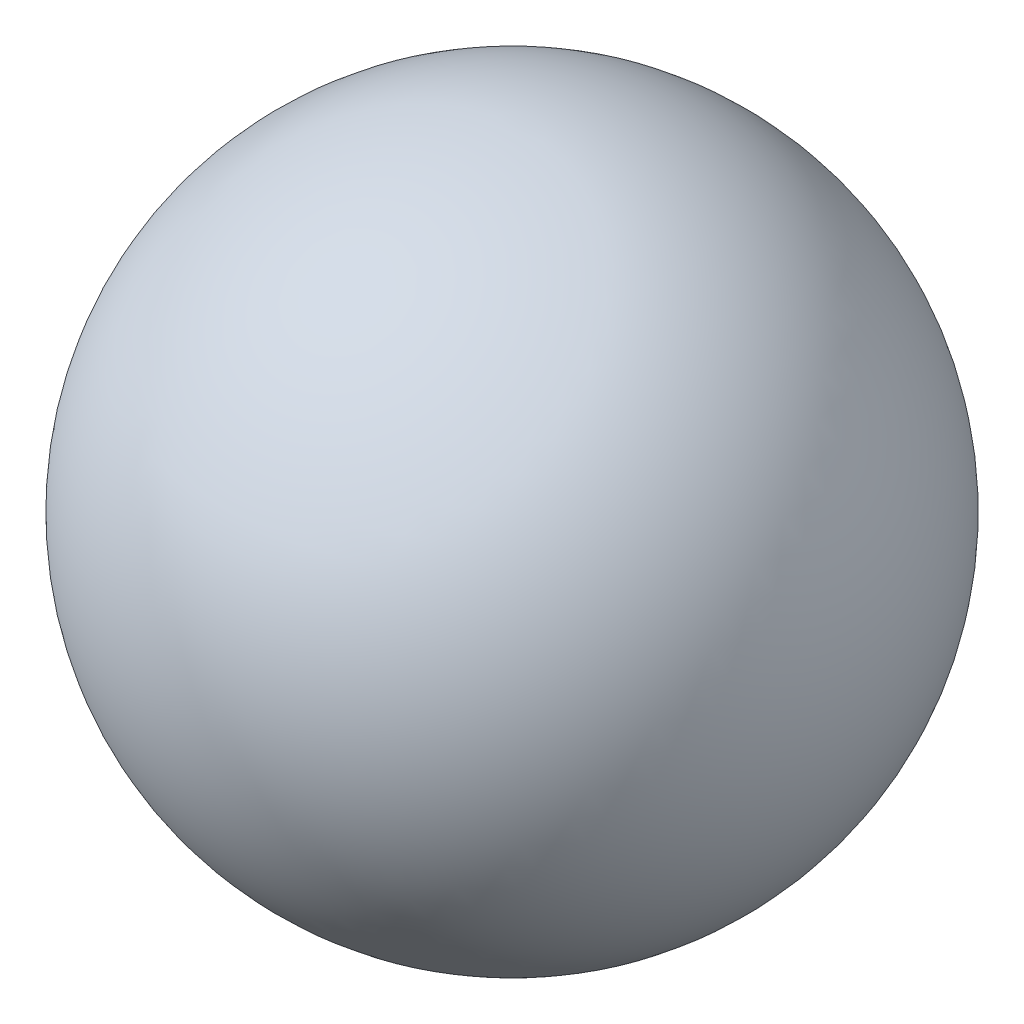
ISO-10303-21;
HEADER;
FILE_DESCRIPTION(('STEP AP214'),'2;1');
FILE_NAME('part.step','',(''),(''),'','','');
FILE_SCHEMA(('AUTOMOTIVE_DESIGN { 1 0 10303 214 1 1 1 1 }'));
ENDSEC;
DATA;
#1=APPLICATION_CONTEXT('core data for automotive mechanical design processes');
#2=APPLICATION_PROTOCOL_DEFINITION('international standard','automotive_design',2000,#1);
#3=PRODUCT_CONTEXT('',#1,'mechanical');
#4=PRODUCT('Part','Part','',(#3));
#5=PRODUCT_RELATED_PRODUCT_CATEGORY('part','',(#4));
#6=PRODUCT_DEFINITION_FORMATION('','',#4);
#7=PRODUCT_DEFINITION_CONTEXT('part definition',#1,'design');
#8=PRODUCT_DEFINITION('design','',#6,#7);
#9=PRODUCT_DEFINITION_SHAPE('','',#8);
#10=(LENGTH_UNIT() NAMED_UNIT(*) SI_UNIT(.MILLI.,.METRE.));
#11=(NAMED_UNIT(*) PLANE_ANGLE_UNIT() SI_UNIT($,.RADIAN.));
#12=(NAMED_UNIT(*) SI_UNIT($,.STERADIAN.) SOLID_ANGLE_UNIT());
#13=UNCERTAINTY_MEASURE_WITH_UNIT(LENGTH_MEASURE(1.E-05),#10,'distance_accuracy_value','');
#14=(GEOMETRIC_REPRESENTATION_CONTEXT(3) GLOBAL_UNCERTAINTY_ASSIGNED_CONTEXT((#13)) GLOBAL_UNIT_ASSIGNED_CONTEXT((#10,
#11,#12)) REPRESENTATION_CONTEXT('',''));
#15=CARTESIAN_POINT('',(0.,0.,0.));
#16=DIRECTION('',(0.,0.,1.));
#17=DIRECTION('',(1.,0.,0.));
#18=AXIS2_PLACEMENT_3D('',#15,#16,#17);
#19=CARTESIAN_POINT('',(0.,1.5748,0.));
#20=DIRECTION('',(0.,1.,0.));
#21=DIRECTION('',(-1.,0.,0.));
#22=AXIS2_PLACEMENT_3D('',#19,#20,#21);
#23=SPHERICAL_SURFACE('',#22,1.5748);
#24=CARTESIAN_POINT('',(0.,3.1496,0.));
#25=VERTEX_POINT('',#24);
#26=VERTEX_LOOP('',#25);
#27=FACE_BOUND('',#26,.T.);
#28=ADVANCED_FACE('F36',(#27),#23,.T.);
#29=CLOSED_SHELL('',(#28));
#30=MANIFOLD_SOLID_BREP('B2',#29);
#31=ADVANCED_BREP_SHAPE_REPRESENTATION('',(#18,#30),#14);
#32=SHAPE_DEFINITION_REPRESENTATION(#9,#31);
ENDSEC;
END-ISO-10303-21;
